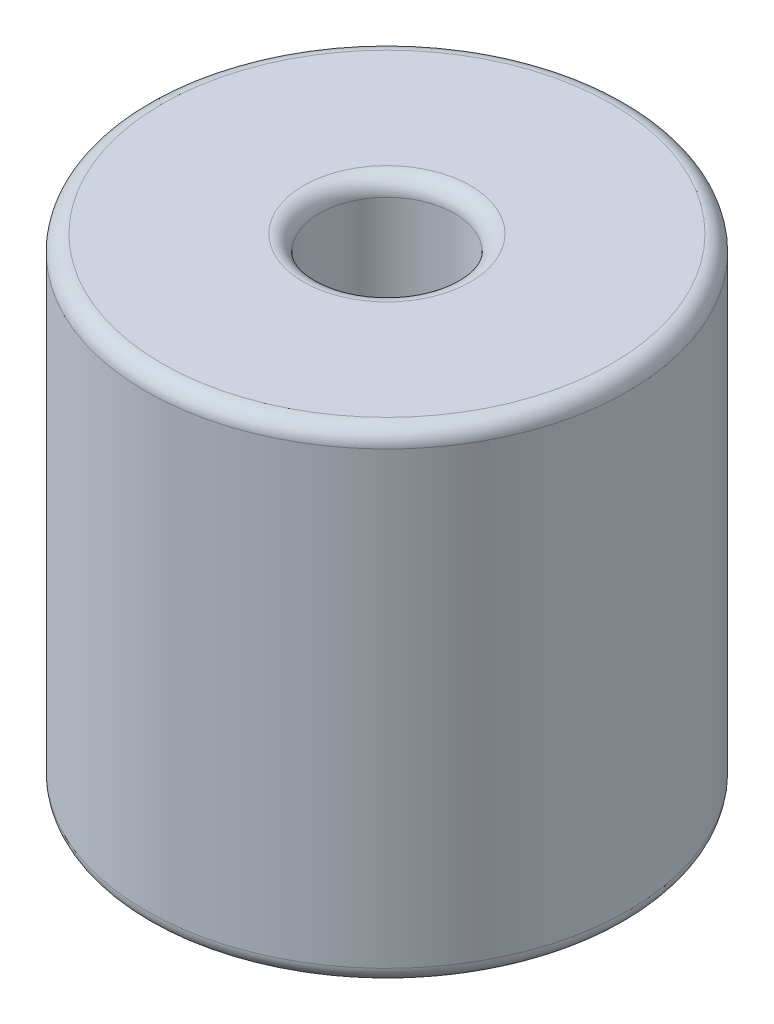
ISO-10303-21;
HEADER;
FILE_DESCRIPTION(('STEP AP214'),'2;1');
FILE_NAME('part.step','',(''),(''),'','','');
FILE_SCHEMA(('AUTOMOTIVE_DESIGN { 1 0 10303 214 1 1 1 1 }'));
ENDSEC;
DATA;
#1=APPLICATION_CONTEXT('core data for automotive mechanical design processes');
#2=APPLICATION_PROTOCOL_DEFINITION('international standard','automotive_design',2000,#1);
#3=PRODUCT_CONTEXT('',#1,'mechanical');
#4=PRODUCT('Part','Part','',(#3));
#5=PRODUCT_RELATED_PRODUCT_CATEGORY('part','',(#4));
#6=PRODUCT_DEFINITION_FORMATION('','',#4);
#7=PRODUCT_DEFINITION_CONTEXT('part definition',#1,'design');
#8=PRODUCT_DEFINITION('design','',#6,#7);
#9=PRODUCT_DEFINITION_SHAPE('','',#8);
#10=(LENGTH_UNIT() NAMED_UNIT(*) SI_UNIT(.MILLI.,.METRE.));
#11=(NAMED_UNIT(*) PLANE_ANGLE_UNIT() SI_UNIT($,.RADIAN.));
#12=(NAMED_UNIT(*) SI_UNIT($,.STERADIAN.) SOLID_ANGLE_UNIT());
#13=UNCERTAINTY_MEASURE_WITH_UNIT(LENGTH_MEASURE(1.E-05),#10,'distance_accuracy_value','');
#14=(GEOMETRIC_REPRESENTATION_CONTEXT(3) GLOBAL_UNCERTAINTY_ASSIGNED_CONTEXT((#13)) GLOBAL_UNIT_ASSIGNED_CONTEXT((#10,
#11,#12)) REPRESENTATION_CONTEXT('',''));
#15=CARTESIAN_POINT('',(0.,0.,0.));
#16=DIRECTION('',(0.,0.,1.));
#17=DIRECTION('',(1.,0.,0.));
#18=AXIS2_PLACEMENT_3D('',#15,#16,#17);
#19=CARTESIAN_POINT('',(0.,15.,0.));
#20=DIRECTION('',(0.,1.,0.));
#21=DIRECTION('',(0.,0.,1.));
#22=AXIS2_PLACEMENT_3D('',#19,#20,#21);
#23=PLANE('',#22);
#24=CARTESIAN_POINT('',(0.,15.,0.));
#25=DIRECTION('',(0.,1.,0.));
#26=DIRECTION('',(0.,0.,1.));
#27=AXIS2_PLACEMENT_3D('',#24,#25,#26);
#28=CIRCLE('',#27,2.6);
#29=CARTESIAN_POINT('',(0.,15.,2.6));
#30=VERTEX_POINT('',#29);
#31=EDGE_CURVE('E42',#30,#30,#28,.F.);
#32=ORIENTED_EDGE('',*,*,#31,.T.);
#33=EDGE_LOOP('',(#32));
#34=FACE_BOUND('',#33,.T.);
#35=CARTESIAN_POINT('',(0.,15.,0.));
#36=DIRECTION('',(0.,1.,0.));
#37=DIRECTION('',(0.,0.,1.));
#38=AXIS2_PLACEMENT_3D('',#35,#36,#37);
#39=CIRCLE('',#38,7.);
#40=CARTESIAN_POINT('',(0.,15.,7.));
#41=VERTEX_POINT('',#40);
#42=EDGE_CURVE('E46',#41,#41,#39,.T.);
#43=ORIENTED_EDGE('',*,*,#42,.T.);
#44=EDGE_LOOP('',(#43));
#45=FACE_BOUND('',#44,.T.);
#46=ADVANCED_FACE('F31',(#34,#45),#23,.T.);
#47=CARTESIAN_POINT('',(0.,0.,0.));
#48=DIRECTION('',(0.,1.,0.));
#49=DIRECTION('',(0.,0.,1.));
#50=AXIS2_PLACEMENT_3D('',#47,#48,#49);
#51=PLANE('',#50);
#52=CARTESIAN_POINT('',(0.,0.,0.));
#53=DIRECTION('',(0.,1.,0.));
#54=DIRECTION('',(0.,0.,1.));
#55=AXIS2_PLACEMENT_3D('',#52,#53,#54);
#56=CIRCLE('',#55,2.6);
#57=CARTESIAN_POINT('',(0.,0.,2.6));
#58=VERTEX_POINT('',#57);
#59=EDGE_CURVE('E57',#58,#58,#56,.T.);
#60=ORIENTED_EDGE('',*,*,#59,.T.);
#61=EDGE_LOOP('',(#60));
#62=FACE_BOUND('',#61,.T.);
#63=CARTESIAN_POINT('',(0.,0.,0.));
#64=DIRECTION('',(0.,1.,0.));
#65=DIRECTION('',(0.,0.,1.));
#66=AXIS2_PLACEMENT_3D('',#63,#64,#65);
#67=CIRCLE('',#66,7.);
#68=CARTESIAN_POINT('',(0.,0.,7.));
#69=VERTEX_POINT('',#68);
#70=EDGE_CURVE('E60',#69,#69,#67,.F.);
#71=ORIENTED_EDGE('',*,*,#70,.T.);
#72=EDGE_LOOP('',(#71));
#73=FACE_BOUND('',#72,.T.);
#74=ADVANCED_FACE('F64',(#62,#73),#51,.F.);
#75=CARTESIAN_POINT('',(0.,15.,0.));
#76=DIRECTION('',(0.,-1.,0.));
#77=DIRECTION('',(0.,0.,-1.));
#78=AXIS2_PLACEMENT_3D('',#75,#76,#77);
#79=CYLINDRICAL_SURFACE('',#78,7.5);
#80=CARTESIAN_POINT('',(0.,0.5,0.));
#81=DIRECTION('',(0.,1.,0.));
#82=DIRECTION('',(0.,0.,1.));
#83=AXIS2_PLACEMENT_3D('',#80,#81,#82);
#84=CIRCLE('',#83,7.5);
#85=CARTESIAN_POINT('',(0.,0.5,7.5));
#86=VERTEX_POINT('',#85);
#87=EDGE_CURVE('E10',#86,#86,#84,.T.);
#88=ORIENTED_EDGE('',*,*,#87,.T.);
#89=EDGE_LOOP('',(#88));
#90=FACE_BOUND('',#89,.T.);
#91=CARTESIAN_POINT('',(0.,14.5,0.));
#92=DIRECTION('',(0.,1.,0.));
#93=DIRECTION('',(0.,0.,1.));
#94=AXIS2_PLACEMENT_3D('',#91,#92,#93);
#95=CIRCLE('',#94,7.5);
#96=CARTESIAN_POINT('',(0.,14.5,7.5));
#97=VERTEX_POINT('',#96);
#98=EDGE_CURVE('E38',#97,#97,#95,.F.);
#99=ORIENTED_EDGE('',*,*,#98,.T.);
#100=EDGE_LOOP('',(#99));
#101=FACE_BOUND('',#100,.T.);
#102=ADVANCED_FACE('F84',(#90,#101),#79,.T.);
#103=CARTESIAN_POINT('',(0.,15.,0.));
#104=DIRECTION('',(0.,-1.,0.));
#105=DIRECTION('',(0.,0.,-1.));
#106=AXIS2_PLACEMENT_3D('',#103,#104,#105);
#107=CYLINDRICAL_SURFACE('',#106,2.1);
#108=CARTESIAN_POINT('',(0.,0.5,0.));
#109=DIRECTION('',(0.,1.,0.));
#110=DIRECTION('',(0.,0.,1.));
#111=AXIS2_PLACEMENT_3D('',#108,#109,#110);
#112=CIRCLE('',#111,2.1);
#113=CARTESIAN_POINT('',(0.,0.5,2.1));
#114=VERTEX_POINT('',#113);
#115=EDGE_CURVE('E51',#114,#114,#112,.F.);
#116=ORIENTED_EDGE('',*,*,#115,.T.);
#117=EDGE_LOOP('',(#116));
#118=FACE_BOUND('',#117,.T.);
#119=CARTESIAN_POINT('',(0.,14.5,0.));
#120=DIRECTION('',(0.,1.,0.));
#121=DIRECTION('',(0.,0.,1.));
#122=AXIS2_PLACEMENT_3D('',#119,#120,#121);
#123=CIRCLE('',#122,2.1);
#124=CARTESIAN_POINT('',(0.,14.5,2.1));
#125=VERTEX_POINT('',#124);
#126=EDGE_CURVE('E54',#125,#125,#123,.T.);
#127=ORIENTED_EDGE('',*,*,#126,.T.);
#128=EDGE_LOOP('',(#127));
#129=FACE_BOUND('',#128,.T.);
#130=ADVANCED_FACE('F89',(#118,#129),#107,.F.);
#131=CARTESIAN_POINT('',(0.,0.5,0.));
#132=DIRECTION('',(0.,1.,0.));
#133=DIRECTION('',(0.,0.,1.));
#134=AXIS2_PLACEMENT_3D('',#131,#132,#133);
#135=TOROIDAL_SURFACE('',#134,2.6,0.5);
#136=ORIENTED_EDGE('',*,*,#115,.F.);
#137=EDGE_LOOP('',(#136));
#138=FACE_BOUND('',#137,.T.);
#139=ORIENTED_EDGE('',*,*,#59,.F.);
#140=EDGE_LOOP('',(#139));
#141=FACE_BOUND('',#140,.T.);
#142=ADVANCED_FACE('F75',(#138,#141),#135,.T.);
#143=CARTESIAN_POINT('',(0.,14.5,0.));
#144=DIRECTION('',(0.,1.,0.));
#145=DIRECTION('',(0.,0.,1.));
#146=AXIS2_PLACEMENT_3D('',#143,#144,#145);
#147=TOROIDAL_SURFACE('',#146,2.6,0.5);
#148=ORIENTED_EDGE('',*,*,#31,.F.);
#149=EDGE_LOOP('',(#148));
#150=FACE_BOUND('',#149,.T.);
#151=ORIENTED_EDGE('',*,*,#126,.F.);
#152=EDGE_LOOP('',(#151));
#153=FACE_BOUND('',#152,.T.);
#154=ADVANCED_FACE('F69',(#150,#153),#147,.T.);
#155=CARTESIAN_POINT('',(0.,0.5,0.));
#156=DIRECTION('',(0.,1.,0.));
#157=DIRECTION('',(0.,0.,1.));
#158=AXIS2_PLACEMENT_3D('',#155,#156,#157);
#159=TOROIDAL_SURFACE('',#158,7.,0.5);
#160=ORIENTED_EDGE('',*,*,#70,.F.);
#161=EDGE_LOOP('',(#160));
#162=FACE_BOUND('',#161,.T.);
#163=ORIENTED_EDGE('',*,*,#87,.F.);
#164=EDGE_LOOP('',(#163));
#165=FACE_BOUND('',#164,.T.);
#166=ADVANCED_FACE('F66',(#162,#165),#159,.T.);
#167=CARTESIAN_POINT('',(0.,14.5,0.));
#168=DIRECTION('',(0.,1.,0.));
#169=DIRECTION('',(0.,0.,1.));
#170=AXIS2_PLACEMENT_3D('',#167,#168,#169);
#171=TOROIDAL_SURFACE('',#170,7.,0.5);
#172=ORIENTED_EDGE('',*,*,#98,.F.);
#173=EDGE_LOOP('',(#172));
#174=FACE_BOUND('',#173,.T.);
#175=ORIENTED_EDGE('',*,*,#42,.F.);
#176=EDGE_LOOP('',(#175));
#177=FACE_BOUND('',#176,.T.);
#178=ADVANCED_FACE('F33',(#174,#177),#171,.T.);
#179=CLOSED_SHELL('',(#46,#74,#102,#130,#142,#154,#166,#178));
#180=MANIFOLD_SOLID_BREP('B2',#179);
#181=ADVANCED_BREP_SHAPE_REPRESENTATION('',(#18,#180),#14);
#182=SHAPE_DEFINITION_REPRESENTATION(#9,#181);
ENDSEC;
END-ISO-10303-21;
